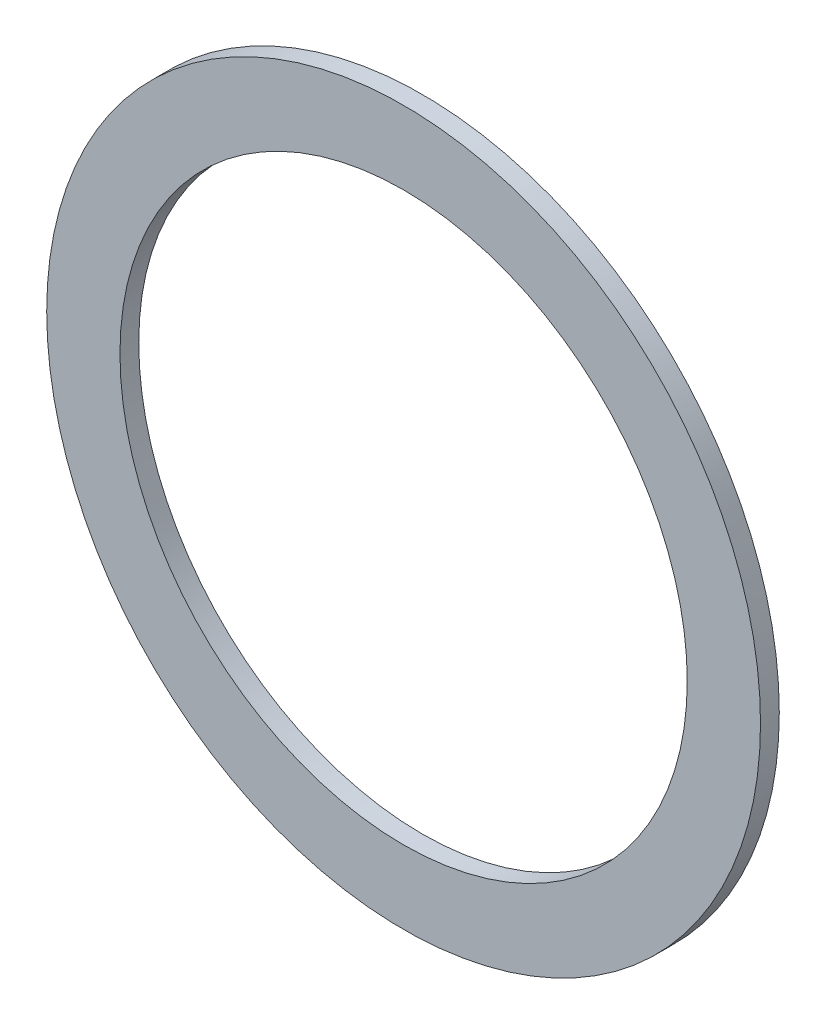
ISO-10303-21;
HEADER;
FILE_DESCRIPTION(('STEP AP214'),'2;1');
FILE_NAME('part.step','',(''),(''),'','','');
FILE_SCHEMA(('AUTOMOTIVE_DESIGN { 1 0 10303 214 1 1 1 1 }'));
ENDSEC;
DATA;
#1=APPLICATION_CONTEXT('core data for automotive mechanical design processes');
#2=APPLICATION_PROTOCOL_DEFINITION('international standard','automotive_design',2000,#1);
#3=PRODUCT_CONTEXT('',#1,'mechanical');
#4=PRODUCT('Part','Part','',(#3));
#5=PRODUCT_RELATED_PRODUCT_CATEGORY('part','',(#4));
#6=PRODUCT_DEFINITION_FORMATION('','',#4);
#7=PRODUCT_DEFINITION_CONTEXT('part definition',#1,'design');
#8=PRODUCT_DEFINITION('design','',#6,#7);
#9=PRODUCT_DEFINITION_SHAPE('','',#8);
#10=(LENGTH_UNIT() NAMED_UNIT(*) SI_UNIT(.MILLI.,.METRE.));
#11=(NAMED_UNIT(*) PLANE_ANGLE_UNIT() SI_UNIT($,.RADIAN.));
#12=(NAMED_UNIT(*) SI_UNIT($,.STERADIAN.) SOLID_ANGLE_UNIT());
#13=UNCERTAINTY_MEASURE_WITH_UNIT(LENGTH_MEASURE(1.E-05),#10,'distance_accuracy_value','');
#14=(GEOMETRIC_REPRESENTATION_CONTEXT(3) GLOBAL_UNCERTAINTY_ASSIGNED_CONTEXT((#13)) GLOBAL_UNIT_ASSIGNED_CONTEXT((#10,
#11,#12)) REPRESENTATION_CONTEXT('',''));
#15=CARTESIAN_POINT('',(0.,0.,0.));
#16=DIRECTION('',(0.,0.,1.));
#17=DIRECTION('',(1.,0.,0.));
#18=AXIS2_PLACEMENT_3D('',#15,#16,#17);
#19=CARTESIAN_POINT('',(0.,0.,0.5));
#20=DIRECTION('',(0.,0.,1.));
#21=DIRECTION('',(1.,0.,0.));
#22=AXIS2_PLACEMENT_3D('',#19,#20,#21);
#23=PLANE('',#22);
#24=CARTESIAN_POINT('',(0.,0.,0.5));
#25=DIRECTION('',(0.,0.,1.));
#26=DIRECTION('',(1.,0.,0.));
#27=AXIS2_PLACEMENT_3D('',#24,#25,#26);
#28=CIRCLE('',#27,19.);
#29=CARTESIAN_POINT('',(19.,0.,0.5));
#30=VERTEX_POINT('',#29);
#31=EDGE_CURVE('E11',#30,#30,#28,.T.);
#32=ORIENTED_EDGE('',*,*,#31,.T.);
#33=EDGE_LOOP('',(#32));
#34=FACE_BOUND('',#33,.T.);
#35=CARTESIAN_POINT('',(0.,0.,0.5));
#36=DIRECTION('',(0.,0.,1.));
#37=DIRECTION('',(1.,0.,0.));
#38=AXIS2_PLACEMENT_3D('',#35,#36,#37);
#39=CIRCLE('',#38,15.1);
#40=CARTESIAN_POINT('',(15.1,0.,0.5));
#41=VERTEX_POINT('',#40);
#42=EDGE_CURVE('E53',#41,#41,#39,.T.);
#43=ORIENTED_EDGE('',*,*,#42,.F.);
#44=EDGE_LOOP('',(#43));
#45=FACE_BOUND('',#44,.T.);
#46=ADVANCED_FACE('F43',(#34,#45),#23,.T.);
#47=CARTESIAN_POINT('',(0.,0.,-0.5));
#48=DIRECTION('',(0.,0.,1.));
#49=DIRECTION('',(1.,0.,0.));
#50=AXIS2_PLACEMENT_3D('',#47,#48,#49);
#51=PLANE('',#50);
#52=CARTESIAN_POINT('',(0.,0.,-0.5));
#53=DIRECTION('',(0.,0.,1.));
#54=DIRECTION('',(1.,0.,0.));
#55=AXIS2_PLACEMENT_3D('',#52,#53,#54);
#56=CIRCLE('',#55,19.);
#57=CARTESIAN_POINT('',(19.,0.,-0.5));
#58=VERTEX_POINT('',#57);
#59=EDGE_CURVE('E50',#58,#58,#56,.T.);
#60=ORIENTED_EDGE('',*,*,#59,.F.);
#61=EDGE_LOOP('',(#60));
#62=FACE_BOUND('',#61,.T.);
#63=CARTESIAN_POINT('',(0.,0.,-0.5));
#64=DIRECTION('',(0.,0.,1.));
#65=DIRECTION('',(1.,0.,0.));
#66=AXIS2_PLACEMENT_3D('',#63,#64,#65);
#67=CIRCLE('',#66,15.1);
#68=CARTESIAN_POINT('',(15.1,0.,-0.5));
#69=VERTEX_POINT('',#68);
#70=EDGE_CURVE('E57',#69,#69,#67,.T.);
#71=ORIENTED_EDGE('',*,*,#70,.T.);
#72=EDGE_LOOP('',(#71));
#73=FACE_BOUND('',#72,.T.);
#74=ADVANCED_FACE('F67',(#62,#73),#51,.F.);
#75=CARTESIAN_POINT('',(0.,0.,0.5));
#76=DIRECTION('',(0.,0.,-1.));
#77=DIRECTION('',(-1.,0.,0.));
#78=AXIS2_PLACEMENT_3D('',#75,#76,#77);
#79=CYLINDRICAL_SURFACE('',#78,19.);
#80=ORIENTED_EDGE('',*,*,#31,.F.);
#81=EDGE_LOOP('',(#80));
#82=FACE_BOUND('',#81,.T.);
#83=ORIENTED_EDGE('',*,*,#59,.T.);
#84=EDGE_LOOP('',(#83));
#85=FACE_BOUND('',#84,.T.);
#86=ADVANCED_FACE('F44',(#82,#85),#79,.T.);
#87=CARTESIAN_POINT('',(0.,0.,0.5));
#88=DIRECTION('',(0.,0.,-1.));
#89=DIRECTION('',(-1.,0.,0.));
#90=AXIS2_PLACEMENT_3D('',#87,#88,#89);
#91=CYLINDRICAL_SURFACE('',#90,15.1);
#92=ORIENTED_EDGE('',*,*,#42,.T.);
#93=EDGE_LOOP('',(#92));
#94=FACE_BOUND('',#93,.T.);
#95=ORIENTED_EDGE('',*,*,#70,.F.);
#96=EDGE_LOOP('',(#95));
#97=FACE_BOUND('',#96,.T.);
#98=ADVANCED_FACE('F62',(#94,#97),#91,.F.);
#99=CLOSED_SHELL('',(#46,#74,#86,#98));
#100=MANIFOLD_SOLID_BREP('B2',#99);
#101=ADVANCED_BREP_SHAPE_REPRESENTATION('',(#18,#100),#14);
#102=SHAPE_DEFINITION_REPRESENTATION(#9,#101);
ENDSEC;
END-ISO-10303-21;
